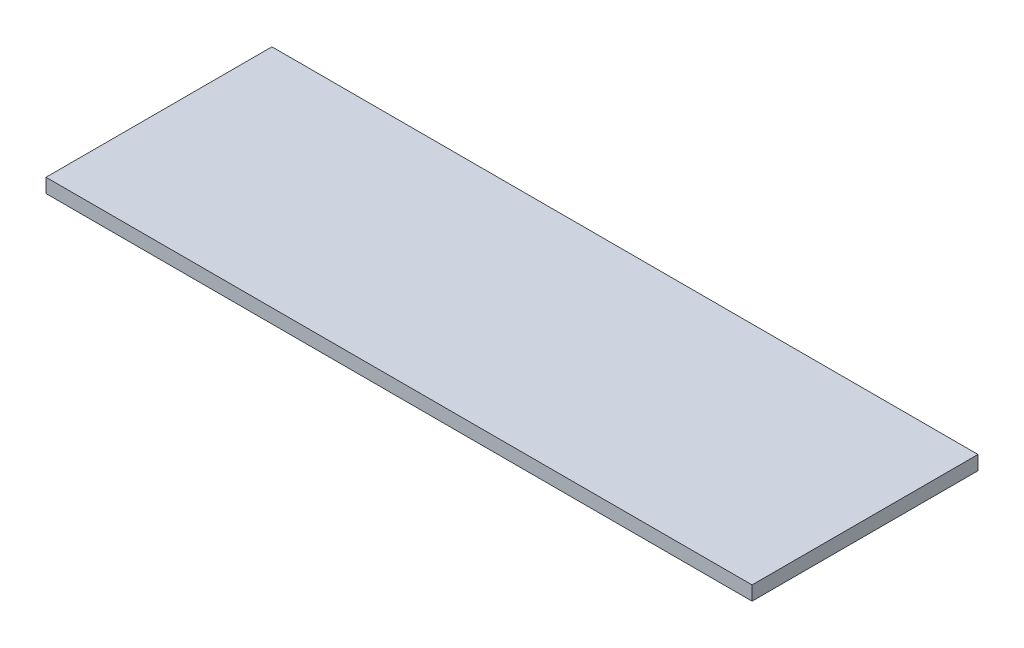
ISO-10303-21;
HEADER;
FILE_DESCRIPTION(('STEP AP214'),'2;1');
FILE_NAME('part.step','',(''),(''),'','','');
FILE_SCHEMA(('AUTOMOTIVE_DESIGN { 1 0 10303 214 1 1 1 1 }'));
ENDSEC;
DATA;
#1=APPLICATION_CONTEXT('core data for automotive mechanical design processes');
#2=APPLICATION_PROTOCOL_DEFINITION('international standard','automotive_design',2000,#1);
#3=PRODUCT_CONTEXT('',#1,'mechanical');
#4=PRODUCT('Part','Part','',(#3));
#5=PRODUCT_RELATED_PRODUCT_CATEGORY('part','',(#4));
#6=PRODUCT_DEFINITION_FORMATION('','',#4);
#7=PRODUCT_DEFINITION_CONTEXT('part definition',#1,'design');
#8=PRODUCT_DEFINITION('design','',#6,#7);
#9=PRODUCT_DEFINITION_SHAPE('','',#8);
#10=(LENGTH_UNIT() NAMED_UNIT(*) SI_UNIT(.MILLI.,.METRE.));
#11=(NAMED_UNIT(*) PLANE_ANGLE_UNIT() SI_UNIT($,.RADIAN.));
#12=(NAMED_UNIT(*) SI_UNIT($,.STERADIAN.) SOLID_ANGLE_UNIT());
#13=UNCERTAINTY_MEASURE_WITH_UNIT(LENGTH_MEASURE(1.E-05),#10,'distance_accuracy_value','');
#14=(GEOMETRIC_REPRESENTATION_CONTEXT(3) GLOBAL_UNCERTAINTY_ASSIGNED_CONTEXT((#13)) GLOBAL_UNIT_ASSIGNED_CONTEXT((#10,
#11,#12)) REPRESENTATION_CONTEXT('',''));
#15=CARTESIAN_POINT('',(0.,0.,0.));
#16=DIRECTION('',(0.,0.,1.));
#17=DIRECTION('',(1.,0.,0.));
#18=AXIS2_PLACEMENT_3D('',#15,#16,#17);
#19=CARTESIAN_POINT('',(317.5,12.7,101.6));
#20=DIRECTION('',(-1.,0.,0.));
#21=DIRECTION('',(0.,0.,1.));
#22=AXIS2_PLACEMENT_3D('',#19,#20,#21);
#23=PLANE('',#22);
#24=DIRECTION('',(0.,0.,-1.));
#25=VECTOR('',#24,1.);
#26=CARTESIAN_POINT('',(317.5,0.,101.6));
#27=LINE('',#26,#25);
#28=CARTESIAN_POINT('',(317.5,0.,101.6));
#29=VERTEX_POINT('',#28);
#30=CARTESIAN_POINT('',(317.5,0.,-101.6));
#31=VERTEX_POINT('',#30);
#32=EDGE_CURVE('E96',#29,#31,#27,.T.);
#33=ORIENTED_EDGE('',*,*,#32,.T.);
#34=DIRECTION('',(0.,-1.,0.));
#35=VECTOR('',#34,1.);
#36=CARTESIAN_POINT('',(317.5,12.7,-101.6));
#37=LINE('',#36,#35);
#38=CARTESIAN_POINT('',(317.5,12.7,-101.6));
#39=VERTEX_POINT('',#38);
#40=EDGE_CURVE('E11',#39,#31,#37,.T.);
#41=ORIENTED_EDGE('',*,*,#40,.F.);
#42=DIRECTION('',(0.,0.,-1.));
#43=VECTOR('',#42,1.);
#44=CARTESIAN_POINT('',(317.5,12.7,101.6));
#45=LINE('',#44,#43);
#46=CARTESIAN_POINT('',(317.5,12.7,101.6));
#47=VERTEX_POINT('',#46);
#48=EDGE_CURVE('E84',#47,#39,#45,.T.);
#49=ORIENTED_EDGE('',*,*,#48,.F.);
#50=DIRECTION('',(0.,-1.,0.));
#51=VECTOR('',#50,1.);
#52=CARTESIAN_POINT('',(317.5,12.7,101.6));
#53=LINE('',#52,#51);
#54=EDGE_CURVE('E92',#47,#29,#53,.T.);
#55=ORIENTED_EDGE('',*,*,#54,.T.);
#56=EDGE_LOOP('',(#33,#41,#49,#55));
#57=FACE_BOUND('',#56,.T.);
#58=ADVANCED_FACE('F33',(#57),#23,.F.);
#59=CARTESIAN_POINT('',(-317.5,12.7,-101.6));
#60=DIRECTION('',(0.,0.,1.));
#61=DIRECTION('',(1.,0.,0.));
#62=AXIS2_PLACEMENT_3D('',#59,#60,#61);
#63=PLANE('',#62);
#64=DIRECTION('',(-1.,0.,0.));
#65=VECTOR('',#64,1.);
#66=CARTESIAN_POINT('',(-317.5,0.,-101.6));
#67=LINE('',#66,#65);
#68=CARTESIAN_POINT('',(-317.5,0.,-101.6));
#69=VERTEX_POINT('',#68);
#70=EDGE_CURVE('E88',#31,#69,#67,.T.);
#71=ORIENTED_EDGE('',*,*,#70,.T.);
#72=DIRECTION('',(0.,-1.,0.));
#73=VECTOR('',#72,1.);
#74=CARTESIAN_POINT('',(-317.5,12.7,-101.6));
#75=LINE('',#74,#73);
#76=CARTESIAN_POINT('',(-317.5,12.7,-101.6));
#77=VERTEX_POINT('',#76);
#78=EDGE_CURVE('E41',#77,#69,#75,.T.);
#79=ORIENTED_EDGE('',*,*,#78,.F.);
#80=DIRECTION('',(-1.,0.,0.));
#81=VECTOR('',#80,1.);
#82=CARTESIAN_POINT('',(-317.5,12.7,-101.6));
#83=LINE('',#82,#81);
#84=EDGE_CURVE('E79',#39,#77,#83,.T.);
#85=ORIENTED_EDGE('',*,*,#84,.F.);
#86=ORIENTED_EDGE('',*,*,#40,.T.);
#87=EDGE_LOOP('',(#71,#79,#85,#86));
#88=FACE_BOUND('',#87,.T.);
#89=ADVANCED_FACE('F87',(#88),#63,.F.);
#90=CARTESIAN_POINT('',(-317.5,12.7,101.6));
#91=DIRECTION('',(1.,0.,0.));
#92=DIRECTION('',(0.,0.,-1.));
#93=AXIS2_PLACEMENT_3D('',#90,#91,#92);
#94=PLANE('',#93);
#95=DIRECTION('',(0.,0.,1.));
#96=VECTOR('',#95,1.);
#97=CARTESIAN_POINT('',(-317.5,0.,101.6));
#98=LINE('',#97,#96);
#99=CARTESIAN_POINT('',(-317.5,0.,101.6));
#100=VERTEX_POINT('',#99);
#101=EDGE_CURVE('E66',#69,#100,#98,.T.);
#102=ORIENTED_EDGE('',*,*,#101,.T.);
#103=DIRECTION('',(0.,-1.,0.));
#104=VECTOR('',#103,1.);
#105=CARTESIAN_POINT('',(-317.5,12.7,101.6));
#106=LINE('',#105,#104);
#107=CARTESIAN_POINT('',(-317.5,12.7,101.6));
#108=VERTEX_POINT('',#107);
#109=EDGE_CURVE('E89',#108,#100,#106,.T.);
#110=ORIENTED_EDGE('',*,*,#109,.F.);
#111=DIRECTION('',(0.,0.,1.));
#112=VECTOR('',#111,1.);
#113=CARTESIAN_POINT('',(-317.5,12.7,101.6));
#114=LINE('',#113,#112);
#115=EDGE_CURVE('E82',#77,#108,#114,.T.);
#116=ORIENTED_EDGE('',*,*,#115,.F.);
#117=ORIENTED_EDGE('',*,*,#78,.T.);
#118=EDGE_LOOP('',(#102,#110,#116,#117));
#119=FACE_BOUND('',#118,.T.);
#120=ADVANCED_FACE('F90',(#119),#94,.F.);
#121=CARTESIAN_POINT('',(-317.5,12.7,101.6));
#122=DIRECTION('',(0.,0.,-1.));
#123=DIRECTION('',(-1.,0.,0.));
#124=AXIS2_PLACEMENT_3D('',#121,#122,#123);
#125=PLANE('',#124);
#126=DIRECTION('',(1.,0.,0.));
#127=VECTOR('',#126,1.);
#128=CARTESIAN_POINT('',(-317.5,0.,101.6));
#129=LINE('',#128,#127);
#130=EDGE_CURVE('E72',#100,#29,#129,.T.);
#131=ORIENTED_EDGE('',*,*,#130,.T.);
#132=ORIENTED_EDGE('',*,*,#54,.F.);
#133=DIRECTION('',(1.,0.,0.));
#134=VECTOR('',#133,1.);
#135=CARTESIAN_POINT('',(-317.5,12.7,101.6));
#136=LINE('',#135,#134);
#137=EDGE_CURVE('E49',#108,#47,#136,.T.);
#138=ORIENTED_EDGE('',*,*,#137,.F.);
#139=ORIENTED_EDGE('',*,*,#109,.T.);
#140=EDGE_LOOP('',(#131,#132,#138,#139));
#141=FACE_BOUND('',#140,.T.);
#142=ADVANCED_FACE('F103',(#141),#125,.F.);
#143=CARTESIAN_POINT('',(0.,12.7,0.));
#144=DIRECTION('',(0.,-1.,0.));
#145=DIRECTION('',(0.,0.,-1.));
#146=AXIS2_PLACEMENT_3D('',#143,#144,#145);
#147=PLANE('',#146);
#148=ORIENTED_EDGE('',*,*,#48,.T.);
#149=ORIENTED_EDGE('',*,*,#84,.T.);
#150=ORIENTED_EDGE('',*,*,#115,.T.);
#151=ORIENTED_EDGE('',*,*,#137,.T.);
#152=EDGE_LOOP('',(#148,#149,#150,#151));
#153=FACE_BOUND('',#152,.T.);
#154=ADVANCED_FACE('F80',(#153),#147,.F.);
#155=CARTESIAN_POINT('',(0.,0.,0.));
#156=DIRECTION('',(0.,-1.,0.));
#157=DIRECTION('',(0.,0.,-1.));
#158=AXIS2_PLACEMENT_3D('',#155,#156,#157);
#159=PLANE('',#158);
#160=ORIENTED_EDGE('',*,*,#32,.F.);
#161=ORIENTED_EDGE('',*,*,#130,.F.);
#162=ORIENTED_EDGE('',*,*,#101,.F.);
#163=ORIENTED_EDGE('',*,*,#70,.F.);
#164=EDGE_LOOP('',(#160,#161,#162,#163));
#165=FACE_BOUND('',#164,.T.);
#166=ADVANCED_FACE('F106',(#165),#159,.T.);
#167=CLOSED_SHELL('',(#58,#89,#120,#142,#154,#166));
#168=MANIFOLD_SOLID_BREP('B2',#167);
#169=ADVANCED_BREP_SHAPE_REPRESENTATION('',(#18,#168),#14);
#170=SHAPE_DEFINITION_REPRESENTATION(#9,#169);
ENDSEC;
END-ISO-10303-21;
